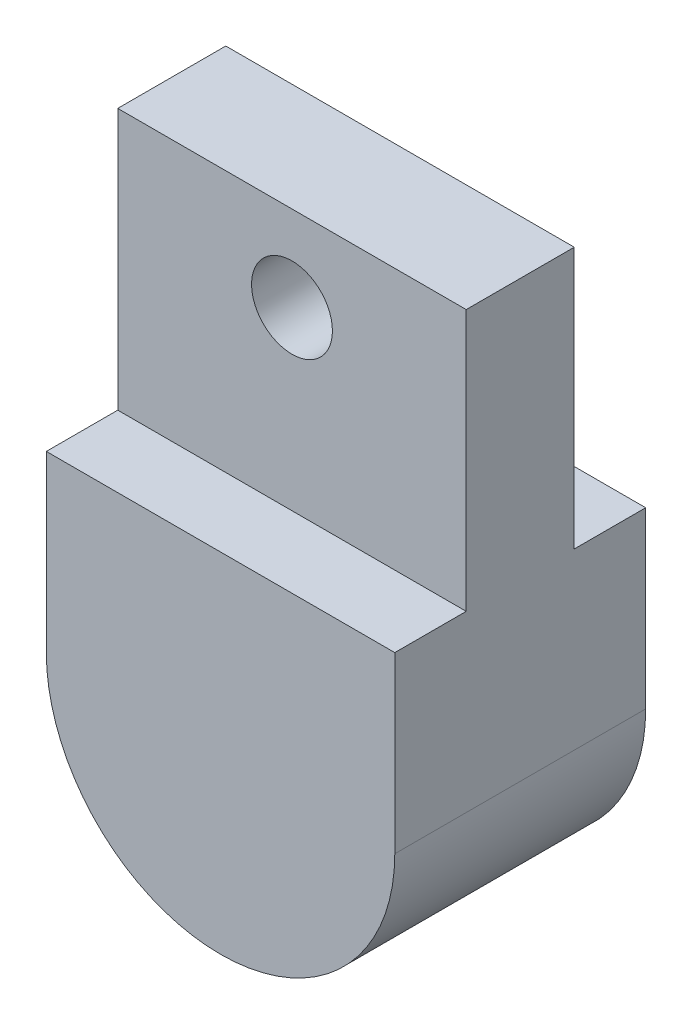
ISO-10303-21;
HEADER;
FILE_DESCRIPTION(('STEP AP214'),'2;1');
FILE_NAME('part.step','',(''),(''),'','','');
FILE_SCHEMA(('AUTOMOTIVE_DESIGN { 1 0 10303 214 1 1 1 1 }'));
ENDSEC;
DATA;
#1=APPLICATION_CONTEXT('core data for automotive mechanical design processes');
#2=APPLICATION_PROTOCOL_DEFINITION('international standard','automotive_design',2000,#1);
#3=PRODUCT_CONTEXT('',#1,'mechanical');
#4=PRODUCT('Part','Part','',(#3));
#5=PRODUCT_RELATED_PRODUCT_CATEGORY('part','',(#4));
#6=PRODUCT_DEFINITION_FORMATION('','',#4);
#7=PRODUCT_DEFINITION_CONTEXT('part definition',#1,'design');
#8=PRODUCT_DEFINITION('design','',#6,#7);
#9=PRODUCT_DEFINITION_SHAPE('','',#8);
#10=(LENGTH_UNIT() NAMED_UNIT(*) SI_UNIT(.MILLI.,.METRE.));
#11=(NAMED_UNIT(*) PLANE_ANGLE_UNIT() SI_UNIT($,.RADIAN.));
#12=(NAMED_UNIT(*) SI_UNIT($,.STERADIAN.) SOLID_ANGLE_UNIT());
#13=UNCERTAINTY_MEASURE_WITH_UNIT(LENGTH_MEASURE(1.E-05),#10,'distance_accuracy_value','');
#14=(GEOMETRIC_REPRESENTATION_CONTEXT(3) GLOBAL_UNCERTAINTY_ASSIGNED_CONTEXT((#13)) GLOBAL_UNIT_ASSIGNED_CONTEXT((#10,
#11,#12)) REPRESENTATION_CONTEXT('',''));
#15=CARTESIAN_POINT('',(0.,0.,0.));
#16=DIRECTION('',(0.,0.,1.));
#17=DIRECTION('',(1.,0.,0.));
#18=AXIS2_PLACEMENT_3D('',#15,#16,#17);
#19=CARTESIAN_POINT('',(6.35,-9.525,-1.9685));
#20=DIRECTION('',(1.,0.,0.));
#21=DIRECTION('',(0.,0.,-1.));
#22=AXIS2_PLACEMENT_3D('',#19,#20,#21);
#23=PLANE('',#22);
#24=DIRECTION('',(0.,0.,-1.));
#25=VECTOR('',#24,1.);
#26=CARTESIAN_POINT('',(6.35,0.,-1.9685));
#27=LINE('',#26,#25);
#28=CARTESIAN_POINT('',(6.35,0.,1.9685));
#29=VERTEX_POINT('',#28);
#30=CARTESIAN_POINT('',(6.35,0.,-1.9685));
#31=VERTEX_POINT('',#30);
#32=EDGE_CURVE('E104',#29,#31,#27,.T.);
#33=ORIENTED_EDGE('',*,*,#32,.F.);
#34=DIRECTION('',(0.,1.,0.));
#35=VECTOR('',#34,1.);
#36=CARTESIAN_POINT('',(6.35,-9.525,1.9685));
#37=LINE('',#36,#35);
#38=CARTESIAN_POINT('',(6.35,-9.525,1.9685));
#39=VERTEX_POINT('',#38);
#40=EDGE_CURVE('E11',#39,#29,#37,.T.);
#41=ORIENTED_EDGE('',*,*,#40,.F.);
#42=DIRECTION('',(0.,0.,1.));
#43=VECTOR('',#42,1.);
#44=CARTESIAN_POINT('',(6.35,-9.525,-4.572));
#45=LINE('',#44,#43);
#46=CARTESIAN_POINT('',(6.35,-9.525,4.572));
#47=VERTEX_POINT('',#46);
#48=EDGE_CURVE('E122',#39,#47,#45,.T.);
#49=ORIENTED_EDGE('',*,*,#48,.T.);
#50=DIRECTION('',(0.,-1.,0.));
#51=VECTOR('',#50,1.);
#52=CARTESIAN_POINT('',(6.35,-15.875,4.572));
#53=LINE('',#52,#51);
#54=CARTESIAN_POINT('',(6.35,-15.875,4.572));
#55=VERTEX_POINT('',#54);
#56=EDGE_CURVE('E132',#47,#55,#53,.T.);
#57=ORIENTED_EDGE('',*,*,#56,.T.);
#58=DIRECTION('',(0.,0.,1.));
#59=VECTOR('',#58,1.);
#60=CARTESIAN_POINT('',(6.35,-15.875,-4.572));
#61=LINE('',#60,#59);
#62=CARTESIAN_POINT('',(6.35,-15.875,-4.572));
#63=VERTEX_POINT('',#62);
#64=EDGE_CURVE('E111',#63,#55,#61,.T.);
#65=ORIENTED_EDGE('',*,*,#64,.F.);
#66=DIRECTION('',(0.,-1.,0.));
#67=VECTOR('',#66,1.);
#68=CARTESIAN_POINT('',(6.35,-15.875,-4.572));
#69=LINE('',#68,#67);
#70=CARTESIAN_POINT('',(6.35,-9.525,-4.572));
#71=VERTEX_POINT('',#70);
#72=EDGE_CURVE('E126',#71,#63,#69,.T.);
#73=ORIENTED_EDGE('',*,*,#72,.F.);
#74=CARTESIAN_POINT('',(6.35,-9.525,-1.9685));
#75=VERTEX_POINT('',#74);
#76=EDGE_CURVE('E120',#71,#75,#45,.T.);
#77=ORIENTED_EDGE('',*,*,#76,.T.);
#78=DIRECTION('',(0.,1.,0.));
#79=VECTOR('',#78,1.);
#80=CARTESIAN_POINT('',(6.35,-9.525,-1.9685));
#81=LINE('',#80,#79);
#82=EDGE_CURVE('E35',#75,#31,#81,.T.);
#83=ORIENTED_EDGE('',*,*,#82,.T.);
#84=EDGE_LOOP('',(#33,#41,#49,#57,#65,#73,#77,#83));
#85=FACE_BOUND('',#84,.T.);
#86=ADVANCED_FACE('F32',(#85),#23,.T.);
#87=CARTESIAN_POINT('',(-6.35,-9.525,1.9685));
#88=DIRECTION('',(0.,0.,1.));
#89=DIRECTION('',(1.,0.,0.));
#90=AXIS2_PLACEMENT_3D('',#87,#88,#89);
#91=PLANE('',#90);
#92=CARTESIAN_POINT('',(0.,-3.11149999999986,1.9685));
#93=DIRECTION('',(0.,0.,1.));
#94=DIRECTION('',(1.,0.,0.));
#95=AXIS2_PLACEMENT_3D('',#92,#93,#94);
#96=CIRCLE('',#95,1.47319999999999);
#97=CARTESIAN_POINT('',(1.47319999999999,-3.11149999999986,1.9685));
#98=VERTEX_POINT('',#97);
#99=EDGE_CURVE('E107',#98,#98,#96,.T.);
#100=ORIENTED_EDGE('',*,*,#99,.F.);
#101=EDGE_LOOP('',(#100));
#102=FACE_BOUND('',#101,.T.);
#103=DIRECTION('',(1.,0.,0.));
#104=VECTOR('',#103,1.);
#105=CARTESIAN_POINT('',(-6.35,0.,1.9685));
#106=LINE('',#105,#104);
#107=CARTESIAN_POINT('',(-6.35,0.,1.9685));
#108=VERTEX_POINT('',#107);
#109=EDGE_CURVE('E82',#108,#29,#106,.T.);
#110=ORIENTED_EDGE('',*,*,#109,.F.);
#111=DIRECTION('',(0.,1.,0.));
#112=VECTOR('',#111,1.);
#113=CARTESIAN_POINT('',(-6.35,-9.525,1.9685));
#114=LINE('',#113,#112);
#115=CARTESIAN_POINT('',(-6.35,-9.525,1.9685));
#116=VERTEX_POINT('',#115);
#117=EDGE_CURVE('E41',#116,#108,#114,.T.);
#118=ORIENTED_EDGE('',*,*,#117,.F.);
#119=DIRECTION('',(1.,0.,0.));
#120=VECTOR('',#119,1.);
#121=CARTESIAN_POINT('',(-6.35,-9.525,1.9685));
#122=LINE('',#121,#120);
#123=EDGE_CURVE('E92',#116,#39,#122,.T.);
#124=ORIENTED_EDGE('',*,*,#123,.T.);
#125=ORIENTED_EDGE('',*,*,#40,.T.);
#126=EDGE_LOOP('',(#110,#118,#124,#125));
#127=FACE_BOUND('',#126,.T.);
#128=ADVANCED_FACE('F86',(#102,#127),#91,.T.);
#129=CARTESIAN_POINT('',(-6.35,-9.525,-1.9685));
#130=DIRECTION('',(-1.,0.,0.));
#131=DIRECTION('',(0.,0.,1.));
#132=AXIS2_PLACEMENT_3D('',#129,#130,#131);
#133=PLANE('',#132);
#134=DIRECTION('',(0.,0.,1.));
#135=VECTOR('',#134,1.);
#136=CARTESIAN_POINT('',(-6.35,0.,-1.9685));
#137=LINE('',#136,#135);
#138=CARTESIAN_POINT('',(-6.35,0.,-1.9685));
#139=VERTEX_POINT('',#138);
#140=EDGE_CURVE('E68',#139,#108,#137,.T.);
#141=ORIENTED_EDGE('',*,*,#140,.F.);
#142=DIRECTION('',(0.,1.,0.));
#143=VECTOR('',#142,1.);
#144=CARTESIAN_POINT('',(-6.35,-9.525,-1.9685));
#145=LINE('',#144,#143);
#146=CARTESIAN_POINT('',(-6.35,-9.525,-1.9685));
#147=VERTEX_POINT('',#146);
#148=EDGE_CURVE('E76',#147,#139,#145,.T.);
#149=ORIENTED_EDGE('',*,*,#148,.F.);
#150=DIRECTION('',(0.,0.,1.));
#151=VECTOR('',#150,1.);
#152=CARTESIAN_POINT('',(-6.35,-9.525,-4.572));
#153=LINE('',#152,#151);
#154=CARTESIAN_POINT('',(-6.35,-9.525,-4.572));
#155=VERTEX_POINT('',#154);
#156=EDGE_CURVE('E49',#155,#147,#153,.T.);
#157=ORIENTED_EDGE('',*,*,#156,.F.);
#158=DIRECTION('',(0.,1.,0.));
#159=VECTOR('',#158,1.);
#160=CARTESIAN_POINT('',(-6.35,-15.875,-4.572));
#161=LINE('',#160,#159);
#162=CARTESIAN_POINT('',(-6.35,-15.875,-4.572));
#163=VERTEX_POINT('',#162);
#164=EDGE_CURVE('E138',#163,#155,#161,.T.);
#165=ORIENTED_EDGE('',*,*,#164,.F.);
#166=DIRECTION('',(0.,0.,1.));
#167=VECTOR('',#166,1.);
#168=CARTESIAN_POINT('',(-6.35,-15.875,-4.572));
#169=LINE('',#168,#167);
#170=CARTESIAN_POINT('',(-6.35,-15.875,4.572));
#171=VERTEX_POINT('',#170);
#172=EDGE_CURVE('E116',#163,#171,#169,.T.);
#173=ORIENTED_EDGE('',*,*,#172,.T.);
#174=DIRECTION('',(0.,1.,0.));
#175=VECTOR('',#174,1.);
#176=CARTESIAN_POINT('',(-6.35,-15.875,4.572));
#177=LINE('',#176,#175);
#178=CARTESIAN_POINT('',(-6.35,-9.525,4.572));
#179=VERTEX_POINT('',#178);
#180=EDGE_CURVE('E127',#171,#179,#177,.T.);
#181=ORIENTED_EDGE('',*,*,#180,.T.);
#182=EDGE_CURVE('E72',#116,#179,#153,.T.);
#183=ORIENTED_EDGE('',*,*,#182,.F.);
#184=ORIENTED_EDGE('',*,*,#117,.T.);
#185=EDGE_LOOP('',(#141,#149,#157,#165,#173,#181,#183,#184));
#186=FACE_BOUND('',#185,.T.);
#187=ADVANCED_FACE('F67',(#186),#133,.T.);
#188=CARTESIAN_POINT('',(-6.35,-9.525,-1.9685));
#189=DIRECTION('',(0.,0.,-1.));
#190=DIRECTION('',(-1.,0.,0.));
#191=AXIS2_PLACEMENT_3D('',#188,#189,#190);
#192=PLANE('',#191);
#193=CARTESIAN_POINT('',(0.,-3.11149999999986,-1.9685));
#194=DIRECTION('',(0.,0.,1.));
#195=DIRECTION('',(1.,0.,0.));
#196=AXIS2_PLACEMENT_3D('',#193,#194,#195);
#197=CIRCLE('',#196,1.4732);
#198=CARTESIAN_POINT('',(1.4732,-3.11149999999986,-1.9685));
#199=VERTEX_POINT('',#198);
#200=EDGE_CURVE('E105',#199,#199,#197,.T.);
#201=ORIENTED_EDGE('',*,*,#200,.T.);
#202=EDGE_LOOP('',(#201));
#203=FACE_BOUND('',#202,.T.);
#204=DIRECTION('',(-1.,0.,0.));
#205=VECTOR('',#204,1.);
#206=CARTESIAN_POINT('',(-6.35,0.,-1.9685));
#207=LINE('',#206,#205);
#208=EDGE_CURVE('E84',#31,#139,#207,.T.);
#209=ORIENTED_EDGE('',*,*,#208,.F.);
#210=ORIENTED_EDGE('',*,*,#82,.F.);
#211=DIRECTION('',(-1.,0.,0.));
#212=VECTOR('',#211,1.);
#213=CARTESIAN_POINT('',(-6.35,-9.525,-1.9685));
#214=LINE('',#213,#212);
#215=EDGE_CURVE('E89',#75,#147,#214,.T.);
#216=ORIENTED_EDGE('',*,*,#215,.T.);
#217=ORIENTED_EDGE('',*,*,#148,.T.);
#218=EDGE_LOOP('',(#209,#210,#216,#217));
#219=FACE_BOUND('',#218,.T.);
#220=ADVANCED_FACE('F198',(#203,#219),#192,.T.);
#221=CARTESIAN_POINT('',(0.,0.,0.));
#222=DIRECTION('',(0.,1.,0.));
#223=DIRECTION('',(0.,0.,1.));
#224=AXIS2_PLACEMENT_3D('',#221,#222,#223);
#225=PLANE('',#224);
#226=ORIENTED_EDGE('',*,*,#32,.T.);
#227=ORIENTED_EDGE('',*,*,#208,.T.);
#228=ORIENTED_EDGE('',*,*,#140,.T.);
#229=ORIENTED_EDGE('',*,*,#109,.T.);
#230=EDGE_LOOP('',(#226,#227,#228,#229));
#231=FACE_BOUND('',#230,.T.);
#232=ADVANCED_FACE('F81',(#231),#225,.T.);
#233=CARTESIAN_POINT('',(0.,-3.11149999999986,1.9685));
#234=DIRECTION('',(0.,0.,1.));
#235=DIRECTION('',(1.,0.,0.));
#236=AXIS2_PLACEMENT_3D('',#233,#234,#235);
#237=CYLINDRICAL_SURFACE('',#236,1.47319999999999);
#238=ORIENTED_EDGE('',*,*,#200,.F.);
#239=EDGE_LOOP('',(#238));
#240=FACE_BOUND('',#239,.T.);
#241=ORIENTED_EDGE('',*,*,#99,.T.);
#242=EDGE_LOOP('',(#241));
#243=FACE_BOUND('',#242,.T.);
#244=ADVANCED_FACE('F207',(#240,#243),#237,.F.);
#245=CARTESIAN_POINT('',(-6.35,-9.525,-4.572));
#246=DIRECTION('',(0.,-1.,0.));
#247=DIRECTION('',(1.,0.,0.));
#248=AXIS2_PLACEMENT_3D('',#245,#246,#247);
#249=PLANE('',#248);
#250=ORIENTED_EDGE('',*,*,#123,.F.);
#251=ORIENTED_EDGE('',*,*,#182,.T.);
#252=DIRECTION('',(1.,0.,0.));
#253=VECTOR('',#252,1.);
#254=CARTESIAN_POINT('',(-6.35,-9.525,4.572));
#255=LINE('',#254,#253);
#256=EDGE_CURVE('E123',#179,#47,#255,.T.);
#257=ORIENTED_EDGE('',*,*,#256,.T.);
#258=ORIENTED_EDGE('',*,*,#48,.F.);
#259=EDGE_LOOP('',(#250,#251,#257,#258));
#260=FACE_BOUND('',#259,.T.);
#261=ADVANCED_FACE('F177',(#260),#249,.F.);
#262=CARTESIAN_POINT('',(0.,-15.875,-4.572));
#263=DIRECTION('',(0.,0.,1.));
#264=DIRECTION('',(1.,0.,0.));
#265=AXIS2_PLACEMENT_3D('',#262,#263,#264);
#266=CYLINDRICAL_SURFACE('',#265,6.35);
#267=CARTESIAN_POINT('',(0.,-15.875,4.572));
#268=DIRECTION('',(0.,0.,-1.));
#269=DIRECTION('',(-1.,0.,0.));
#270=AXIS2_PLACEMENT_3D('',#267,#268,#269);
#271=CIRCLE('',#270,6.35);
#272=EDGE_CURVE('E129',#55,#171,#271,.T.);
#273=ORIENTED_EDGE('',*,*,#272,.T.);
#274=ORIENTED_EDGE('',*,*,#172,.F.);
#275=CARTESIAN_POINT('',(0.,-15.875,-4.572));
#276=DIRECTION('',(0.,0.,-1.));
#277=DIRECTION('',(-1.,0.,0.));
#278=AXIS2_PLACEMENT_3D('',#275,#276,#277);
#279=CIRCLE('',#278,6.35);
#280=EDGE_CURVE('E141',#63,#163,#279,.T.);
#281=ORIENTED_EDGE('',*,*,#280,.F.);
#282=ORIENTED_EDGE('',*,*,#64,.T.);
#283=EDGE_LOOP('',(#273,#274,#281,#282));
#284=FACE_BOUND('',#283,.T.);
#285=ADVANCED_FACE('F161',(#284),#266,.T.);
#286=ORIENTED_EDGE('',*,*,#215,.F.);
#287=ORIENTED_EDGE('',*,*,#76,.F.);
#288=DIRECTION('',(1.,0.,0.));
#289=VECTOR('',#288,1.);
#290=CARTESIAN_POINT('',(-6.35,-9.525,-4.572));
#291=LINE('',#290,#289);
#292=EDGE_CURVE('E135',#155,#71,#291,.T.);
#293=ORIENTED_EDGE('',*,*,#292,.F.);
#294=ORIENTED_EDGE('',*,*,#156,.T.);
#295=EDGE_LOOP('',(#286,#287,#293,#294));
#296=FACE_BOUND('',#295,.T.);
#297=ADVANCED_FACE('F186',(#296),#249,.F.);
#298=CARTESIAN_POINT('',(0.,-15.875,-4.572));
#299=DIRECTION('',(0.,0.,-1.));
#300=DIRECTION('',(-1.,0.,0.));
#301=AXIS2_PLACEMENT_3D('',#298,#299,#300);
#302=PLANE('',#301);
#303=ORIENTED_EDGE('',*,*,#72,.T.);
#304=ORIENTED_EDGE('',*,*,#280,.T.);
#305=ORIENTED_EDGE('',*,*,#164,.T.);
#306=ORIENTED_EDGE('',*,*,#292,.T.);
#307=EDGE_LOOP('',(#303,#304,#305,#306));
#308=FACE_BOUND('',#307,.T.);
#309=ADVANCED_FACE('F149',(#308),#302,.T.);
#310=CARTESIAN_POINT('',(0.,-15.875,4.572));
#311=DIRECTION('',(0.,0.,-1.));
#312=DIRECTION('',(-1.,0.,0.));
#313=AXIS2_PLACEMENT_3D('',#310,#311,#312);
#314=PLANE('',#313);
#315=ORIENTED_EDGE('',*,*,#56,.F.);
#316=ORIENTED_EDGE('',*,*,#256,.F.);
#317=ORIENTED_EDGE('',*,*,#180,.F.);
#318=ORIENTED_EDGE('',*,*,#272,.F.);
#319=EDGE_LOOP('',(#315,#316,#317,#318));
#320=FACE_BOUND('',#319,.T.);
#321=ADVANCED_FACE('F180',(#320),#314,.F.);
#322=CLOSED_SHELL('',(#86,#128,#187,#220,#232,#244,#261,#285,#297,#309,#321));
#323=MANIFOLD_SOLID_BREP('B2',#322);
#324=ADVANCED_BREP_SHAPE_REPRESENTATION('',(#18,#323),#14);
#325=SHAPE_DEFINITION_REPRESENTATION(#9,#324);
ENDSEC;
END-ISO-10303-21;
